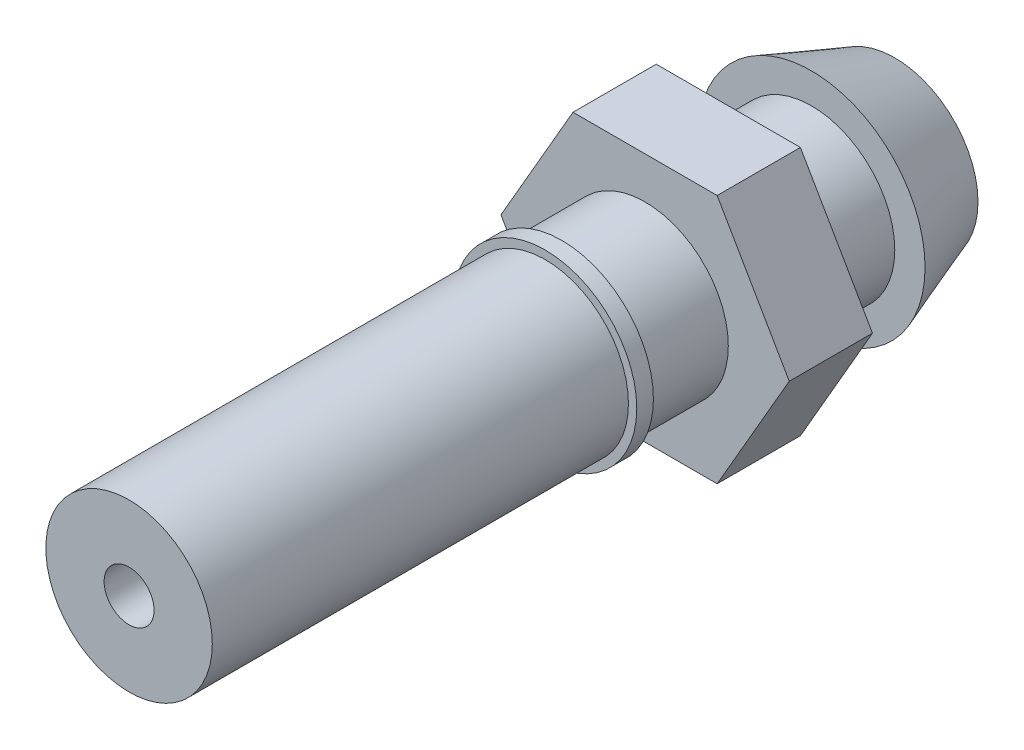
ISO-10303-21;
HEADER;
FILE_DESCRIPTION(('STEP AP214'),'2;1');
FILE_NAME('part.step','',(''),(''),'','','');
FILE_SCHEMA(('AUTOMOTIVE_DESIGN { 1 0 10303 214 1 1 1 1 }'));
ENDSEC;
DATA;
#1=APPLICATION_CONTEXT('core data for automotive mechanical design processes');
#2=APPLICATION_PROTOCOL_DEFINITION('international standard','automotive_design',2000,#1);
#3=PRODUCT_CONTEXT('',#1,'mechanical');
#4=PRODUCT('Part','Part','',(#3));
#5=PRODUCT_RELATED_PRODUCT_CATEGORY('part','',(#4));
#6=PRODUCT_DEFINITION_FORMATION('','',#4);
#7=PRODUCT_DEFINITION_CONTEXT('part definition',#1,'design');
#8=PRODUCT_DEFINITION('design','',#6,#7);
#9=PRODUCT_DEFINITION_SHAPE('','',#8);
#10=(LENGTH_UNIT() NAMED_UNIT(*) SI_UNIT(.MILLI.,.METRE.));
#11=(NAMED_UNIT(*) PLANE_ANGLE_UNIT() SI_UNIT($,.RADIAN.));
#12=(NAMED_UNIT(*) SI_UNIT($,.STERADIAN.) SOLID_ANGLE_UNIT());
#13=UNCERTAINTY_MEASURE_WITH_UNIT(LENGTH_MEASURE(1.E-05),#10,'distance_accuracy_value','');
#14=(GEOMETRIC_REPRESENTATION_CONTEXT(3) GLOBAL_UNCERTAINTY_ASSIGNED_CONTEXT((#13)) GLOBAL_UNIT_ASSIGNED_CONTEXT((#10,
#11,#12)) REPRESENTATION_CONTEXT('',''));
#15=CARTESIAN_POINT('',(0.,0.,0.));
#16=DIRECTION('',(0.,0.,1.));
#17=DIRECTION('',(1.,0.,0.));
#18=AXIS2_PLACEMENT_3D('',#15,#16,#17);
#19=CARTESIAN_POINT('',(0.,0.,-11.684));
#20=DIRECTION('',(0.,0.,1.));
#21=DIRECTION('',(1.,0.,0.));
#22=AXIS2_PLACEMENT_3D('',#19,#20,#21);
#23=CONICAL_SURFACE('',#22,1.27,0.349065850398867);
#24=CARTESIAN_POINT('',(0.,0.,-11.684));
#25=DIRECTION('',(0.,0.,1.));
#26=DIRECTION('',(1.,0.,0.));
#27=AXIS2_PLACEMENT_3D('',#24,#25,#26);
#28=CIRCLE('',#27,1.27);
#29=CARTESIAN_POINT('',(1.27,0.,-11.684));
#30=VERTEX_POINT('',#29);
#31=EDGE_CURVE('E11',#30,#30,#28,.T.);
#32=ORIENTED_EDGE('',*,*,#31,.T.);
#33=EDGE_LOOP('',(#32));
#34=FACE_BOUND('',#33,.T.);
#35=CARTESIAN_POINT('',(0.,0.,-10.414));
#36=DIRECTION('',(0.,0.,1.));
#37=DIRECTION('',(1.,0.,0.));
#38=AXIS2_PLACEMENT_3D('',#35,#36,#37);
#39=CIRCLE('',#38,1.73224219751808);
#40=CARTESIAN_POINT('',(1.73224219751808,0.,-10.414));
#41=VERTEX_POINT('',#40);
#42=EDGE_CURVE('E54',#41,#41,#39,.T.);
#43=ORIENTED_EDGE('',*,*,#42,.F.);
#44=EDGE_LOOP('',(#43));
#45=FACE_BOUND('',#44,.T.);
#46=ADVANCED_FACE('F47',(#34,#45),#23,.T.);
#47=CARTESIAN_POINT('',(0.,0.,-11.684));
#48=DIRECTION('',(0.,0.,-1.));
#49=DIRECTION('',(1.,0.,0.));
#50=AXIS2_PLACEMENT_3D('',#47,#48,#49);
#51=PLANE('',#50);
#52=CARTESIAN_POINT('',(0.,0.,-11.684));
#53=DIRECTION('',(0.,0.,1.));
#54=DIRECTION('',(1.,0.,0.));
#55=AXIS2_PLACEMENT_3D('',#52,#53,#54);
#56=CIRCLE('',#55,0.381);
#57=CARTESIAN_POINT('',(0.381,0.,-11.684));
#58=VERTEX_POINT('',#57);
#59=EDGE_CURVE('E60',#58,#58,#56,.T.);
#60=ORIENTED_EDGE('',*,*,#59,.T.);
#61=EDGE_LOOP('',(#60));
#62=FACE_BOUND('',#61,.T.);
#63=ORIENTED_EDGE('',*,*,#31,.F.);
#64=EDGE_LOOP('',(#63));
#65=FACE_BOUND('',#64,.T.);
#66=ADVANCED_FACE('F72',(#62,#65),#51,.T.);
#67=CARTESIAN_POINT('',(0.,0.,-10.414));
#68=DIRECTION('',(0.,0.,-1.));
#69=DIRECTION('',(1.,0.,0.));
#70=AXIS2_PLACEMENT_3D('',#67,#68,#69);
#71=PLANE('',#70);
#72=CARTESIAN_POINT('',(0.,0.,-10.414));
#73=DIRECTION('',(0.,0.,1.));
#74=DIRECTION('',(1.,0.,0.));
#75=AXIS2_PLACEMENT_3D('',#72,#73,#74);
#76=CIRCLE('',#75,0.381);
#77=CARTESIAN_POINT('',(0.381,0.,-10.414));
#78=VERTEX_POINT('',#77);
#79=EDGE_CURVE('E50',#78,#78,#76,.T.);
#80=ORIENTED_EDGE('',*,*,#79,.F.);
#81=EDGE_LOOP('',(#80));
#82=FACE_BOUND('',#81,.T.);
#83=ORIENTED_EDGE('',*,*,#42,.T.);
#84=EDGE_LOOP('',(#83));
#85=FACE_BOUND('',#84,.T.);
#86=ADVANCED_FACE('F69',(#82,#85),#71,.F.);
#87=CARTESIAN_POINT('',(0.,0.,0.));
#88=DIRECTION('',(0.,0.,-1.));
#89=DIRECTION('',(1.,0.,0.));
#90=AXIS2_PLACEMENT_3D('',#87,#88,#89);
#91=CYLINDRICAL_SURFACE('',#90,0.381);
#92=ORIENTED_EDGE('',*,*,#59,.F.);
#93=EDGE_LOOP('',(#92));
#94=FACE_BOUND('',#93,.T.);
#95=ORIENTED_EDGE('',*,*,#79,.T.);
#96=EDGE_LOOP('',(#95));
#97=FACE_BOUND('',#96,.T.);
#98=ADVANCED_FACE('F67',(#94,#97),#91,.F.);
#99=CLOSED_SHELL('',(#46,#66,#86,#98));
#100=MANIFOLD_SOLID_BREP('B2',#99);
#101=CARTESIAN_POINT('',(0.,0.,-9.144));
#102=DIRECTION('',(0.,0.,-1.));
#103=DIRECTION('',(1.,0.,0.));
#104=AXIS2_PLACEMENT_3D('',#101,#102,#103);
#105=PLANE('',#104);
#106=DIRECTION('',(0.5,0.866025403784439,0.));
#107=VECTOR('',#106,1.);
#108=CARTESIAN_POINT('',(1.09985226280624,-1.905,-9.144));
#109=LINE('',#108,#107);
#110=CARTESIAN_POINT('',(1.09985226280624,-1.905,-9.144));
#111=VERTEX_POINT('',#110);
#112=CARTESIAN_POINT('',(2.19970452561247,0.,-9.144));
#113=VERTEX_POINT('',#112);
#114=EDGE_CURVE('E213',#111,#113,#109,.T.);
#115=ORIENTED_EDGE('',*,*,#114,.F.);
#116=DIRECTION('',(1.,0.,0.));
#117=VECTOR('',#116,1.);
#118=CARTESIAN_POINT('',(-1.09985226280624,-1.905,-9.144));
#119=LINE('',#118,#117);
#120=CARTESIAN_POINT('',(-1.09985226280624,-1.905,-9.144));
#121=VERTEX_POINT('',#120);
#122=EDGE_CURVE('E193',#121,#111,#119,.T.);
#123=ORIENTED_EDGE('',*,*,#122,.F.);
#124=DIRECTION('',(0.5,-0.866025403784439,0.));
#125=VECTOR('',#124,1.);
#126=CARTESIAN_POINT('',(-2.19970452561247,0.,-9.144));
#127=LINE('',#126,#125);
#128=CARTESIAN_POINT('',(-2.19970452561247,0.,-9.144));
#129=VERTEX_POINT('',#128);
#130=EDGE_CURVE('E174',#129,#121,#127,.T.);
#131=ORIENTED_EDGE('',*,*,#130,.F.);
#132=DIRECTION('',(-0.5,-0.866025403784439,0.));
#133=VECTOR('',#132,1.);
#134=CARTESIAN_POINT('',(-1.09985226280624,1.905,-9.144));
#135=LINE('',#134,#133);
#136=CARTESIAN_POINT('',(-1.09985226280624,1.905,-9.144));
#137=VERTEX_POINT('',#136);
#138=EDGE_CURVE('E184',#137,#129,#135,.T.);
#139=ORIENTED_EDGE('',*,*,#138,.F.);
#140=DIRECTION('',(-1.,0.,0.));
#141=VECTOR('',#140,1.);
#142=CARTESIAN_POINT('',(1.09985226280624,1.905,-9.144));
#143=LINE('',#142,#141);
#144=CARTESIAN_POINT('',(1.09985226280624,1.905,-9.144));
#145=VERTEX_POINT('',#144);
#146=EDGE_CURVE('E189',#145,#137,#143,.T.);
#147=ORIENTED_EDGE('',*,*,#146,.F.);
#148=DIRECTION('',(-0.5,0.866025403784439,0.));
#149=VECTOR('',#148,1.);
#150=CARTESIAN_POINT('',(2.19970452561247,0.,-9.144));
#151=LINE('',#150,#149);
#152=EDGE_CURVE('E415',#113,#145,#151,.T.);
#153=ORIENTED_EDGE('',*,*,#152,.F.);
#154=EDGE_LOOP('',(#115,#123,#131,#139,#147,#153));
#155=FACE_BOUND('',#154,.T.);
#156=CARTESIAN_POINT('',(0.,0.,-9.144));
#157=DIRECTION('',(0.,0.,1.));
#158=DIRECTION('',(1.,0.,0.));
#159=AXIS2_PLACEMENT_3D('',#156,#157,#158);
#160=CIRCLE('',#159,1.27);
#161=CARTESIAN_POINT('',(1.27,0.,-9.144));
#162=VERTEX_POINT('',#161);
#163=EDGE_CURVE('E408',#162,#162,#160,.T.);
#164=ORIENTED_EDGE('',*,*,#163,.T.);
#165=EDGE_LOOP('',(#164));
#166=FACE_BOUND('',#165,.T.);
#167=ADVANCED_FACE('F109',(#155,#166),#105,.T.);
#168=CARTESIAN_POINT('',(0.,0.,-6.604));
#169=DIRECTION('',(0.,0.,-1.));
#170=DIRECTION('',(1.,0.,0.));
#171=AXIS2_PLACEMENT_3D('',#168,#169,#170);
#172=PLANE('',#171);
#173=CARTESIAN_POINT('',(0.,0.,-6.604));
#174=DIRECTION('',(0.,0.,1.));
#175=DIRECTION('',(1.,0.,0.));
#176=AXIS2_PLACEMENT_3D('',#173,#174,#175);
#177=CIRCLE('',#176,1.397);
#178=CARTESIAN_POINT('',(1.397,0.,-6.604));
#179=VERTEX_POINT('',#178);
#180=EDGE_CURVE('E227',#179,#179,#177,.T.);
#181=ORIENTED_EDGE('',*,*,#180,.F.);
#182=EDGE_LOOP('',(#181));
#183=FACE_BOUND('',#182,.T.);
#184=CARTESIAN_POINT('',(0.,0.,-6.604));
#185=DIRECTION('',(0.,0.,1.));
#186=DIRECTION('',(1.,0.,0.));
#187=AXIS2_PLACEMENT_3D('',#184,#185,#186);
#188=CIRCLE('',#187,1.27);
#189=CARTESIAN_POINT('',(1.27,0.,-6.604));
#190=VERTEX_POINT('',#189);
#191=EDGE_CURVE('E220',#190,#190,#188,.T.);
#192=ORIENTED_EDGE('',*,*,#191,.T.);
#193=EDGE_LOOP('',(#192));
#194=FACE_BOUND('',#193,.T.);
#195=ADVANCED_FACE('F237',(#183,#194),#172,.T.);
#196=CARTESIAN_POINT('',(0.,0.,-6.35));
#197=DIRECTION('',(0.,0.,1.));
#198=DIRECTION('',(-1.,0.,0.));
#199=AXIS2_PLACEMENT_3D('',#196,#197,#198);
#200=CYLINDRICAL_SURFACE('',#199,1.27);
#201=CARTESIAN_POINT('',(0.,0.,-6.35));
#202=DIRECTION('',(0.,0.,1.));
#203=DIRECTION('',(1.,0.,0.));
#204=AXIS2_PLACEMENT_3D('',#201,#202,#203);
#205=CIRCLE('',#204,1.27);
#206=CARTESIAN_POINT('',(1.27,0.,-6.35));
#207=VERTEX_POINT('',#206);
#208=EDGE_CURVE('E45',#207,#207,#205,.T.);
#209=ORIENTED_EDGE('',*,*,#208,.T.);
#210=EDGE_LOOP('',(#209));
#211=FACE_BOUND('',#210,.T.);
#212=CARTESIAN_POINT('',(0.,0.,0.));
#213=DIRECTION('',(0.,0.,1.));
#214=DIRECTION('',(1.,0.,0.));
#215=AXIS2_PLACEMENT_3D('',#212,#213,#214);
#216=CIRCLE('',#215,1.27);
#217=CARTESIAN_POINT('',(1.27,0.,0.));
#218=VERTEX_POINT('',#217);
#219=EDGE_CURVE('E119',#218,#218,#216,.T.);
#220=ORIENTED_EDGE('',*,*,#219,.F.);
#221=EDGE_LOOP('',(#220));
#222=FACE_BOUND('',#221,.T.);
#223=ADVANCED_FACE('F111',(#211,#222),#200,.T.);
#224=CARTESIAN_POINT('',(0.,0.,0.));
#225=DIRECTION('',(0.,0.,-1.));
#226=DIRECTION('',(1.,0.,0.));
#227=AXIS2_PLACEMENT_3D('',#224,#225,#226);
#228=PLANE('',#227);
#229=CARTESIAN_POINT('',(0.,0.,0.));
#230=DIRECTION('',(0.,0.,1.));
#231=DIRECTION('',(1.,0.,0.));
#232=AXIS2_PLACEMENT_3D('',#229,#230,#231);
#233=CIRCLE('',#232,0.381);
#234=CARTESIAN_POINT('',(0.381,0.,0.));
#235=VERTEX_POINT('',#234);
#236=EDGE_CURVE('E406',#235,#235,#233,.T.);
#237=ORIENTED_EDGE('',*,*,#236,.F.);
#238=EDGE_LOOP('',(#237));
#239=FACE_BOUND('',#238,.T.);
#240=ORIENTED_EDGE('',*,*,#219,.T.);
#241=EDGE_LOOP('',(#240));
#242=FACE_BOUND('',#241,.T.);
#243=ADVANCED_FACE('F234',(#239,#242),#228,.F.);
#244=CARTESIAN_POINT('',(0.,0.,-6.35));
#245=DIRECTION('',(0.,0.,-1.));
#246=DIRECTION('',(1.,0.,0.));
#247=AXIS2_PLACEMENT_3D('',#244,#245,#246);
#248=PLANE('',#247);
#249=CARTESIAN_POINT('',(0.,0.,-6.35));
#250=DIRECTION('',(0.,0.,1.));
#251=DIRECTION('',(1.,0.,0.));
#252=AXIS2_PLACEMENT_3D('',#249,#250,#251);
#253=CIRCLE('',#252,1.397);
#254=CARTESIAN_POINT('',(1.397,0.,-6.35));
#255=VERTEX_POINT('',#254);
#256=EDGE_CURVE('E224',#255,#255,#253,.T.);
#257=ORIENTED_EDGE('',*,*,#256,.T.);
#258=EDGE_LOOP('',(#257));
#259=FACE_BOUND('',#258,.T.);
#260=ORIENTED_EDGE('',*,*,#208,.F.);
#261=EDGE_LOOP('',(#260));
#262=FACE_BOUND('',#261,.T.);
#263=ADVANCED_FACE('F243',(#259,#262),#248,.F.);
#264=CARTESIAN_POINT('',(0.,0.,-6.604));
#265=DIRECTION('',(0.,0.,1.));
#266=DIRECTION('',(-1.,0.,0.));
#267=AXIS2_PLACEMENT_3D('',#264,#265,#266);
#268=CYLINDRICAL_SURFACE('',#267,1.397);
#269=ORIENTED_EDGE('',*,*,#180,.T.);
#270=EDGE_LOOP('',(#269));
#271=FACE_BOUND('',#270,.T.);
#272=ORIENTED_EDGE('',*,*,#256,.F.);
#273=EDGE_LOOP('',(#272));
#274=FACE_BOUND('',#273,.T.);
#275=ADVANCED_FACE('F278',(#271,#274),#268,.T.);
#276=CARTESIAN_POINT('',(0.,0.,-7.874));
#277=DIRECTION('',(0.,0.,1.));
#278=DIRECTION('',(-1.,0.,0.));
#279=AXIS2_PLACEMENT_3D('',#276,#277,#278);
#280=CYLINDRICAL_SURFACE('',#279,1.27);
#281=CARTESIAN_POINT('',(0.,0.,-7.874));
#282=DIRECTION('',(0.,0.,1.));
#283=DIRECTION('',(1.,0.,0.));
#284=AXIS2_PLACEMENT_3D('',#281,#282,#283);
#285=CIRCLE('',#284,1.27);
#286=CARTESIAN_POINT('',(1.27,0.,-7.874));
#287=VERTEX_POINT('',#286);
#288=EDGE_CURVE('E221',#287,#287,#285,.T.);
#289=ORIENTED_EDGE('',*,*,#288,.T.);
#290=EDGE_LOOP('',(#289));
#291=FACE_BOUND('',#290,.T.);
#292=ORIENTED_EDGE('',*,*,#191,.F.);
#293=EDGE_LOOP('',(#292));
#294=FACE_BOUND('',#293,.T.);
#295=ADVANCED_FACE('F259',(#291,#294),#280,.T.);
#296=CARTESIAN_POINT('',(0.,0.,-7.874));
#297=DIRECTION('',(0.,0.,-1.));
#298=DIRECTION('',(1.,0.,0.));
#299=AXIS2_PLACEMENT_3D('',#296,#297,#298);
#300=PLANE('',#299);
#301=DIRECTION('',(0.5,0.866025403784439,0.));
#302=VECTOR('',#301,1.);
#303=CARTESIAN_POINT('',(1.09985226280624,-1.905,-7.874));
#304=LINE('',#303,#302);
#305=CARTESIAN_POINT('',(1.09985226280624,-1.905,-7.874));
#306=VERTEX_POINT('',#305);
#307=CARTESIAN_POINT('',(2.19970452561247,0.,-7.874));
#308=VERTEX_POINT('',#307);
#309=EDGE_CURVE('E198',#306,#308,#304,.T.);
#310=ORIENTED_EDGE('',*,*,#309,.T.);
#311=DIRECTION('',(-0.5,0.866025403784439,0.));
#312=VECTOR('',#311,1.);
#313=CARTESIAN_POINT('',(2.19970452561247,0.,-7.874));
#314=LINE('',#313,#312);
#315=CARTESIAN_POINT('',(1.09985226280624,1.905,-7.874));
#316=VERTEX_POINT('',#315);
#317=EDGE_CURVE('E201',#308,#316,#314,.T.);
#318=ORIENTED_EDGE('',*,*,#317,.T.);
#319=DIRECTION('',(-1.,0.,0.));
#320=VECTOR('',#319,1.);
#321=CARTESIAN_POINT('',(1.09985226280624,1.905,-7.874));
#322=LINE('',#321,#320);
#323=CARTESIAN_POINT('',(-1.09985226280624,1.905,-7.874));
#324=VERTEX_POINT('',#323);
#325=EDGE_CURVE('E205',#316,#324,#322,.T.);
#326=ORIENTED_EDGE('',*,*,#325,.T.);
#327=DIRECTION('',(-0.5,-0.866025403784439,0.));
#328=VECTOR('',#327,1.);
#329=CARTESIAN_POINT('',(-1.09985226280624,1.905,-7.874));
#330=LINE('',#329,#328);
#331=CARTESIAN_POINT('',(-2.19970452561247,0.,-7.874));
#332=VERTEX_POINT('',#331);
#333=EDGE_CURVE('E208',#324,#332,#330,.T.);
#334=ORIENTED_EDGE('',*,*,#333,.T.);
#335=DIRECTION('',(0.5,-0.866025403784439,0.));
#336=VECTOR('',#335,1.);
#337=CARTESIAN_POINT('',(-2.19970452561247,0.,-7.874));
#338=LINE('',#337,#336);
#339=CARTESIAN_POINT('',(-1.09985226280624,-1.905,-7.874));
#340=VERTEX_POINT('',#339);
#341=EDGE_CURVE('E177',#332,#340,#338,.T.);
#342=ORIENTED_EDGE('',*,*,#341,.T.);
#343=DIRECTION('',(1.,0.,0.));
#344=VECTOR('',#343,1.);
#345=CARTESIAN_POINT('',(-1.09985226280624,-1.905,-7.874));
#346=LINE('',#345,#344);
#347=EDGE_CURVE('E211',#340,#306,#346,.T.);
#348=ORIENTED_EDGE('',*,*,#347,.T.);
#349=EDGE_LOOP('',(#310,#318,#326,#334,#342,#348));
#350=FACE_BOUND('',#349,.T.);
#351=ORIENTED_EDGE('',*,*,#288,.F.);
#352=EDGE_LOOP('',(#351));
#353=FACE_BOUND('',#352,.T.);
#354=ADVANCED_FACE('F255',(#350,#353),#300,.F.);
#355=CARTESIAN_POINT('',(1.09985226280624,-1.905,-9.144));
#356=DIRECTION('',(-0.866025403784439,0.5,0.));
#357=DIRECTION('',(-0.5,-0.866025403784439,0.));
#358=AXIS2_PLACEMENT_3D('',#355,#356,#357);
#359=PLANE('',#358);
#360=ORIENTED_EDGE('',*,*,#309,.F.);
#361=DIRECTION('',(0.,0.,1.));
#362=VECTOR('',#361,1.);
#363=CARTESIAN_POINT('',(1.09985226280624,-1.905,-9.144));
#364=LINE('',#363,#362);
#365=EDGE_CURVE('E128',#111,#306,#364,.T.);
#366=ORIENTED_EDGE('',*,*,#365,.F.);
#367=ORIENTED_EDGE('',*,*,#114,.T.);
#368=DIRECTION('',(0.,0.,1.));
#369=VECTOR('',#368,1.);
#370=CARTESIAN_POINT('',(2.19970452561247,0.,-9.144));
#371=LINE('',#370,#369);
#372=EDGE_CURVE('E162',#113,#308,#371,.T.);
#373=ORIENTED_EDGE('',*,*,#372,.T.);
#374=EDGE_LOOP('',(#360,#366,#367,#373));
#375=FACE_BOUND('',#374,.T.);
#376=ADVANCED_FACE('F258',(#375),#359,.F.);
#377=CARTESIAN_POINT('',(2.19970452561247,0.,-9.144));
#378=DIRECTION('',(-0.866025403784438,-0.5,0.));
#379=DIRECTION('',(0.5,-0.866025403784439,0.));
#380=AXIS2_PLACEMENT_3D('',#377,#378,#379);
#381=PLANE('',#380);
#382=ORIENTED_EDGE('',*,*,#317,.F.);
#383=ORIENTED_EDGE('',*,*,#372,.F.);
#384=ORIENTED_EDGE('',*,*,#152,.T.);
#385=DIRECTION('',(0.,0.,1.));
#386=VECTOR('',#385,1.);
#387=CARTESIAN_POINT('',(1.09985226280624,1.905,-9.144));
#388=LINE('',#387,#386);
#389=EDGE_CURVE('E217',#145,#316,#388,.T.);
#390=ORIENTED_EDGE('',*,*,#389,.T.);
#391=EDGE_LOOP('',(#382,#383,#384,#390));
#392=FACE_BOUND('',#391,.T.);
#393=ADVANCED_FACE('F271',(#392),#381,.F.);
#394=CARTESIAN_POINT('',(1.09985226280624,1.905,-9.144));
#395=DIRECTION('',(0.,-1.,0.));
#396=DIRECTION('',(1.,0.,0.));
#397=AXIS2_PLACEMENT_3D('',#394,#395,#396);
#398=PLANE('',#397);
#399=ORIENTED_EDGE('',*,*,#325,.F.);
#400=ORIENTED_EDGE('',*,*,#389,.F.);
#401=ORIENTED_EDGE('',*,*,#146,.T.);
#402=DIRECTION('',(0.,0.,1.));
#403=VECTOR('',#402,1.);
#404=CARTESIAN_POINT('',(-1.09985226280624,1.905,-9.144));
#405=LINE('',#404,#403);
#406=EDGE_CURVE('E181',#137,#324,#405,.T.);
#407=ORIENTED_EDGE('',*,*,#406,.T.);
#408=EDGE_LOOP('',(#399,#400,#401,#407));
#409=FACE_BOUND('',#408,.T.);
#410=ADVANCED_FACE('F268',(#409),#398,.F.);
#411=CARTESIAN_POINT('',(-1.09985226280624,1.905,-9.144));
#412=DIRECTION('',(0.866025403784439,-0.5,0.));
#413=DIRECTION('',(0.5,0.866025403784439,0.));
#414=AXIS2_PLACEMENT_3D('',#411,#412,#413);
#415=PLANE('',#414);
#416=ORIENTED_EDGE('',*,*,#333,.F.);
#417=ORIENTED_EDGE('',*,*,#406,.F.);
#418=ORIENTED_EDGE('',*,*,#138,.T.);
#419=DIRECTION('',(0.,0.,1.));
#420=VECTOR('',#419,1.);
#421=CARTESIAN_POINT('',(-2.19970452561247,0.,-9.144));
#422=LINE('',#421,#420);
#423=EDGE_CURVE('E170',#129,#332,#422,.T.);
#424=ORIENTED_EDGE('',*,*,#423,.T.);
#425=EDGE_LOOP('',(#416,#417,#418,#424));
#426=FACE_BOUND('',#425,.T.);
#427=ADVANCED_FACE('F185',(#426),#415,.F.);
#428=CARTESIAN_POINT('',(-2.19970452561247,0.,-9.144));
#429=DIRECTION('',(0.866025403784439,0.5,0.));
#430=DIRECTION('',(-0.5,0.866025403784439,0.));
#431=AXIS2_PLACEMENT_3D('',#428,#429,#430);
#432=PLANE('',#431);
#433=ORIENTED_EDGE('',*,*,#341,.F.);
#434=ORIENTED_EDGE('',*,*,#423,.F.);
#435=ORIENTED_EDGE('',*,*,#130,.T.);
#436=DIRECTION('',(0.,0.,1.));
#437=VECTOR('',#436,1.);
#438=CARTESIAN_POINT('',(-1.09985226280624,-1.905,-9.144));
#439=LINE('',#438,#437);
#440=EDGE_CURVE('E151',#121,#340,#439,.T.);
#441=ORIENTED_EDGE('',*,*,#440,.T.);
#442=EDGE_LOOP('',(#433,#434,#435,#441));
#443=FACE_BOUND('',#442,.T.);
#444=ADVANCED_FACE('F172',(#443),#432,.F.);
#445=CARTESIAN_POINT('',(-1.09985226280624,-1.905,-9.144));
#446=DIRECTION('',(0.,1.,0.));
#447=DIRECTION('',(0.,0.,-1.));
#448=AXIS2_PLACEMENT_3D('',#445,#446,#447);
#449=PLANE('',#448);
#450=ORIENTED_EDGE('',*,*,#347,.F.);
#451=ORIENTED_EDGE('',*,*,#440,.F.);
#452=ORIENTED_EDGE('',*,*,#122,.T.);
#453=ORIENTED_EDGE('',*,*,#365,.T.);
#454=EDGE_LOOP('',(#450,#451,#452,#453));
#455=FACE_BOUND('',#454,.T.);
#456=ADVANCED_FACE('F261',(#455),#449,.F.);
#457=CARTESIAN_POINT('',(0.,0.,-10.414));
#458=DIRECTION('',(0.,0.,1.));
#459=DIRECTION('',(-1.,0.,0.));
#460=AXIS2_PLACEMENT_3D('',#457,#458,#459);
#461=CYLINDRICAL_SURFACE('',#460,1.27);
#462=CARTESIAN_POINT('',(0.,0.,-10.414));
#463=DIRECTION('',(0.,0.,1.));
#464=DIRECTION('',(1.,0.,0.));
#465=AXIS2_PLACEMENT_3D('',#462,#463,#464);
#466=CIRCLE('',#465,1.27);
#467=CARTESIAN_POINT('',(1.27,0.,-10.414));
#468=VERTEX_POINT('',#467);
#469=EDGE_CURVE('E202',#468,#468,#466,.T.);
#470=ORIENTED_EDGE('',*,*,#469,.T.);
#471=EDGE_LOOP('',(#470));
#472=FACE_BOUND('',#471,.T.);
#473=ORIENTED_EDGE('',*,*,#163,.F.);
#474=EDGE_LOOP('',(#473));
#475=FACE_BOUND('',#474,.T.);
#476=ADVANCED_FACE('F253',(#472,#475),#461,.T.);
#477=CARTESIAN_POINT('',(0.,0.,-10.414));
#478=DIRECTION('',(0.,0.,-1.));
#479=DIRECTION('',(1.,0.,0.));
#480=AXIS2_PLACEMENT_3D('',#477,#478,#479);
#481=PLANE('',#480);
#482=CARTESIAN_POINT('',(0.,0.,-10.414));
#483=DIRECTION('',(0.,0.,1.));
#484=DIRECTION('',(1.,0.,0.));
#485=AXIS2_PLACEMENT_3D('',#482,#483,#484);
#486=CIRCLE('',#485,0.381);
#487=CARTESIAN_POINT('',(0.381,0.,-10.414));
#488=VERTEX_POINT('',#487);
#489=EDGE_CURVE('E113',#488,#488,#486,.T.);
#490=ORIENTED_EDGE('',*,*,#489,.T.);
#491=EDGE_LOOP('',(#490));
#492=FACE_BOUND('',#491,.T.);
#493=ORIENTED_EDGE('',*,*,#469,.F.);
#494=EDGE_LOOP('',(#493));
#495=FACE_BOUND('',#494,.T.);
#496=ADVANCED_FACE('F336',(#492,#495),#481,.T.);
#497=CARTESIAN_POINT('',(0.,0.,0.));
#498=DIRECTION('',(0.,0.,-1.));
#499=DIRECTION('',(1.,0.,0.));
#500=AXIS2_PLACEMENT_3D('',#497,#498,#499);
#501=CYLINDRICAL_SURFACE('',#500,0.381);
#502=ORIENTED_EDGE('',*,*,#489,.F.);
#503=EDGE_LOOP('',(#502));
#504=FACE_BOUND('',#503,.T.);
#505=ORIENTED_EDGE('',*,*,#236,.T.);
#506=EDGE_LOOP('',(#505));
#507=FACE_BOUND('',#506,.T.);
#508=ADVANCED_FACE('F343',(#504,#507),#501,.F.);
#509=CLOSED_SHELL('',(#167,#195,#223,#243,#263,#275,#295,#354,#376,#393,#410,#427,#444,#456,
#476,#496,#508));
#510=MANIFOLD_SOLID_BREP('B6',#509);
#511=ADVANCED_BREP_SHAPE_REPRESENTATION('',(#18,#100,#510),#14);
#512=SHAPE_DEFINITION_REPRESENTATION(#9,#511);
ENDSEC;
END-ISO-10303-21;
